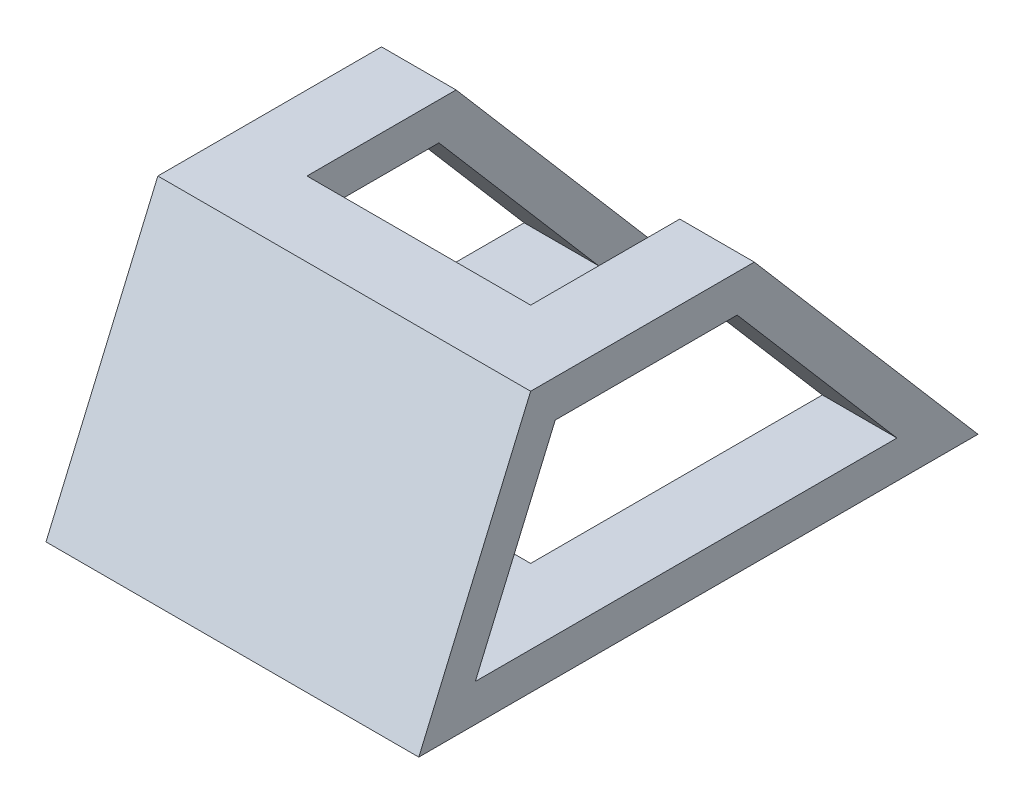
ISO-10303-21;
HEADER;
FILE_DESCRIPTION(('STEP AP214'),'2;1');
FILE_NAME('part.step','',(''),(''),'','','');
FILE_SCHEMA(('AUTOMOTIVE_DESIGN { 1 0 10303 214 1 1 1 1 }'));
ENDSEC;
DATA;
#1=APPLICATION_CONTEXT('core data for automotive mechanical design processes');
#2=APPLICATION_PROTOCOL_DEFINITION('international standard','automotive_design',2000,#1);
#3=PRODUCT_CONTEXT('',#1,'mechanical');
#4=PRODUCT('Part','Part','',(#3));
#5=PRODUCT_RELATED_PRODUCT_CATEGORY('part','',(#4));
#6=PRODUCT_DEFINITION_FORMATION('','',#4);
#7=PRODUCT_DEFINITION_CONTEXT('part definition',#1,'design');
#8=PRODUCT_DEFINITION('design','',#6,#7);
#9=PRODUCT_DEFINITION_SHAPE('','',#8);
#10=(LENGTH_UNIT() NAMED_UNIT(*) SI_UNIT(.MILLI.,.METRE.));
#11=(NAMED_UNIT(*) PLANE_ANGLE_UNIT() SI_UNIT($,.RADIAN.));
#12=(NAMED_UNIT(*) SI_UNIT($,.STERADIAN.) SOLID_ANGLE_UNIT());
#13=UNCERTAINTY_MEASURE_WITH_UNIT(LENGTH_MEASURE(1.E-05),#10,'distance_accuracy_value','');
#14=(GEOMETRIC_REPRESENTATION_CONTEXT(3) GLOBAL_UNCERTAINTY_ASSIGNED_CONTEXT((#13)) GLOBAL_UNIT_ASSIGNED_CONTEXT((#10,
#11,#12)) REPRESENTATION_CONTEXT('',''));
#15=CARTESIAN_POINT('',(0.,0.,0.));
#16=DIRECTION('',(0.,0.,1.));
#17=DIRECTION('',(1.,0.,0.));
#18=AXIS2_PLACEMENT_3D('',#15,#16,#17);
#19=CARTESIAN_POINT('',(-100.,-27.6040869565217,-96.6893641970609));
#20=DIRECTION('',(0.,0.650791373455968,-0.759256602365297));
#21=DIRECTION('',(0.,0.759256602365297,0.650791373455968));
#22=AXIS2_PLACEMENT_3D('',#19,#20,#21);
#23=PLANE('',#22);
#24=DIRECTION('',(0.,0.759256602365297,0.650791373455968));
#25=VECTOR('',#24,1.);
#26=CARTESIAN_POINT('',(-80.,-27.6040869565217,-96.6893641970609));
#27=LINE('',#26,#25);
#28=CARTESIAN_POINT('',(-80.,-27.6040869565218,-96.6893641970609));
#29=VERTEX_POINT('',#28);
#30=CARTESIAN_POINT('',(-80.,42.3959130434783,-36.6893641970609));
#31=VERTEX_POINT('',#30);
#32=EDGE_CURVE('E156',#29,#31,#27,.T.);
#33=ORIENTED_EDGE('',*,*,#32,.F.);
#34=DIRECTION('',(1.,0.,0.));
#35=VECTOR('',#34,1.);
#36=CARTESIAN_POINT('',(-100.,-27.6040869565217,-96.6893641970609));
#37=LINE('',#36,#35);
#38=CARTESIAN_POINT('',(-100.,-27.6040869565217,-96.6893641970609));
#39=VERTEX_POINT('',#38);
#40=EDGE_CURVE('E169',#39,#29,#37,.T.);
#41=ORIENTED_EDGE('',*,*,#40,.F.);
#42=DIRECTION('',(0.,0.759256602365297,0.650791373455968));
#43=VECTOR('',#42,1.);
#44=CARTESIAN_POINT('',(-100.,-27.6040869565217,-96.6893641970609));
#45=LINE('',#44,#43);
#46=CARTESIAN_POINT('',(-100.,42.3959130434783,-36.6893641970609));
#47=VERTEX_POINT('',#46);
#48=EDGE_CURVE('E263',#39,#47,#45,.T.);
#49=ORIENTED_EDGE('',*,*,#48,.T.);
#50=DIRECTION('',(1.,0.,0.));
#51=VECTOR('',#50,1.);
#52=CARTESIAN_POINT('',(-100.,42.3959130434783,-36.6893641970609));
#53=LINE('',#52,#51);
#54=EDGE_CURVE('E171',#47,#31,#53,.T.);
#55=ORIENTED_EDGE('',*,*,#54,.T.);
#56=EDGE_LOOP('',(#33,#41,#49,#55));
#57=FACE_BOUND('',#56,.T.);
#58=ADVANCED_FACE('F41',(#57),#23,.T.);
#59=CARTESIAN_POINT('',(-100.,-17.6040869565217,-74.9471578294996));
#60=DIRECTION('',(0.,0.650791373455968,-0.759256602365297));
#61=DIRECTION('',(0.,0.759256602365297,0.650791373455968));
#62=AXIS2_PLACEMENT_3D('',#59,#60,#61);
#63=PLANE('',#62);
#64=DIRECTION('',(1.,0.,0.));
#65=VECTOR('',#64,1.);
#66=CARTESIAN_POINT('',(-100.,-17.6040869565217,-74.9471578294996));
#67=LINE('',#66,#65);
#68=CARTESIAN_POINT('',(-100.,-17.6040869565217,-74.9471578294996));
#69=VERTEX_POINT('',#68);
#70=CARTESIAN_POINT('',(-80.,-17.6040869565217,-74.9471578294996));
#71=VERTEX_POINT('',#70);
#72=EDGE_CURVE('E247',#69,#71,#67,.T.);
#73=ORIENTED_EDGE('',*,*,#72,.T.);
#74=DIRECTION('',(0.,0.759256602365297,0.650791373455968));
#75=VECTOR('',#74,1.);
#76=CARTESIAN_POINT('',(-80.,-17.6040869565217,-74.9471578294996));
#77=LINE('',#76,#75);
#78=CARTESIAN_POINT('',(-80.,32.3959130434783,-32.0900149723567));
#79=VERTEX_POINT('',#78);
#80=EDGE_CURVE('E219',#71,#79,#77,.T.);
#81=ORIENTED_EDGE('',*,*,#80,.T.);
#82=DIRECTION('',(1.,0.,0.));
#83=VECTOR('',#82,1.);
#84=CARTESIAN_POINT('',(-100.,32.3959130434783,-32.0900149723567));
#85=LINE('',#84,#83);
#86=CARTESIAN_POINT('',(-100.,32.3959130434783,-32.0900149723567));
#87=VERTEX_POINT('',#86);
#88=EDGE_CURVE('E256',#87,#79,#85,.T.);
#89=ORIENTED_EDGE('',*,*,#88,.F.);
#90=DIRECTION('',(0.,0.759256602365297,0.650791373455968));
#91=VECTOR('',#90,1.);
#92=CARTESIAN_POINT('',(-100.,-17.6040869565217,-74.9471578294996));
#93=LINE('',#92,#91);
#94=EDGE_CURVE('E223',#69,#87,#93,.T.);
#95=ORIENTED_EDGE('',*,*,#94,.F.);
#96=EDGE_LOOP('',(#73,#81,#89,#95));
#97=FACE_BOUND('',#96,.T.);
#98=ADVANCED_FACE('F322',(#97),#63,.F.);
#99=CARTESIAN_POINT('',(-100.,42.3959130434783,23.3106358029391));
#100=DIRECTION('',(0.,0.393919298579168,0.919145030018058));
#101=DIRECTION('',(0.,-0.919145030018058,0.393919298579168));
#102=AXIS2_PLACEMENT_3D('',#99,#100,#101);
#103=PLANE('',#102);
#104=DIRECTION('',(0.,-0.919145030018058,0.393919298579168));
#105=VECTOR('',#104,1.);
#106=CARTESIAN_POINT('',(0.,42.3959130434783,23.3106358029391));
#107=LINE('',#106,#105);
#108=CARTESIAN_POINT('',(0.,42.3959130434783,23.3106358029391));
#109=VERTEX_POINT('',#108);
#110=CARTESIAN_POINT('',(0.,-27.6040869565217,53.3106358029391));
#111=VERTEX_POINT('',#110);
#112=EDGE_CURVE('E250',#109,#111,#107,.T.);
#113=ORIENTED_EDGE('',*,*,#112,.F.);
#114=DIRECTION('',(1.,0.,0.));
#115=VECTOR('',#114,1.);
#116=CARTESIAN_POINT('',(-100.,42.3959130434783,23.3106358029391));
#117=LINE('',#116,#115);
#118=CARTESIAN_POINT('',(-100.,42.3959130434783,23.3106358029391));
#119=VERTEX_POINT('',#118);
#120=EDGE_CURVE('E189',#119,#109,#117,.T.);
#121=ORIENTED_EDGE('',*,*,#120,.F.);
#122=DIRECTION('',(0.,-0.919145030018058,0.393919298579168));
#123=VECTOR('',#122,1.);
#124=CARTESIAN_POINT('',(-100.,42.3959130434783,23.3106358029391));
#125=LINE('',#124,#123);
#126=CARTESIAN_POINT('',(-100.,-27.6040869565217,53.3106358029391));
#127=VERTEX_POINT('',#126);
#128=EDGE_CURVE('E258',#119,#127,#125,.T.);
#129=ORIENTED_EDGE('',*,*,#128,.T.);
#130=DIRECTION('',(1.,0.,0.));
#131=VECTOR('',#130,1.);
#132=CARTESIAN_POINT('',(-100.,-27.6040869565217,53.3106358029391));
#133=LINE('',#132,#131);
#134=EDGE_CURVE('E183',#127,#111,#133,.T.);
#135=ORIENTED_EDGE('',*,*,#134,.T.);
#136=EDGE_LOOP('',(#113,#121,#129,#135));
#137=FACE_BOUND('',#136,.T.);
#138=ADVANCED_FACE('F43',(#137),#103,.T.);
#139=CARTESIAN_POINT('',(-100.,42.3959130434783,-36.6893641970609));
#140=DIRECTION('',(0.,1.,0.));
#141=DIRECTION('',(0.,0.,1.));
#142=AXIS2_PLACEMENT_3D('',#139,#140,#141);
#143=PLANE('',#142);
#144=DIRECTION('',(0.,0.,1.));
#145=VECTOR('',#144,1.);
#146=CARTESIAN_POINT('',(-80.,42.3959130434783,-96.6893641970609));
#147=LINE('',#146,#145);
#148=CARTESIAN_POINT('',(-80.,42.3959130434783,3.31063580293914));
#149=VERTEX_POINT('',#148);
#150=EDGE_CURVE('E204',#31,#149,#147,.T.);
#151=ORIENTED_EDGE('',*,*,#150,.F.);
#152=ORIENTED_EDGE('',*,*,#54,.F.);
#153=DIRECTION('',(0.,0.,1.));
#154=VECTOR('',#153,1.);
#155=CARTESIAN_POINT('',(-100.,42.3959130434783,-36.6893641970609));
#156=LINE('',#155,#154);
#157=EDGE_CURVE('E187',#47,#119,#156,.T.);
#158=ORIENTED_EDGE('',*,*,#157,.T.);
#159=ORIENTED_EDGE('',*,*,#120,.T.);
#160=DIRECTION('',(0.,0.,1.));
#161=VECTOR('',#160,1.);
#162=CARTESIAN_POINT('',(0.,42.3959130434783,-36.6893641970609));
#163=LINE('',#162,#161);
#164=CARTESIAN_POINT('',(0.,42.3959130434783,-36.6893641970609));
#165=VERTEX_POINT('',#164);
#166=EDGE_CURVE('E261',#165,#109,#163,.T.);
#167=ORIENTED_EDGE('',*,*,#166,.F.);
#168=CARTESIAN_POINT('',(-20.,42.3959130434783,-36.6893641970609));
#169=VERTEX_POINT('',#168);
#170=EDGE_CURVE('E179',#169,#165,#53,.T.);
#171=ORIENTED_EDGE('',*,*,#170,.F.);
#172=DIRECTION('',(0.,0.,-1.));
#173=VECTOR('',#172,1.);
#174=CARTESIAN_POINT('',(-20.,42.3959130434783,-96.6893641970609));
#175=LINE('',#174,#173);
#176=CARTESIAN_POINT('',(-20.,42.3959130434783,3.31063580293914));
#177=VERTEX_POINT('',#176);
#178=EDGE_CURVE('E292',#177,#169,#175,.T.);
#179=ORIENTED_EDGE('',*,*,#178,.F.);
#180=DIRECTION('',(1.,0.,0.));
#181=VECTOR('',#180,1.);
#182=CARTESIAN_POINT('',(-80.,42.3959130434783,3.31063580293914));
#183=LINE('',#182,#181);
#184=EDGE_CURVE('E164',#149,#177,#183,.T.);
#185=ORIENTED_EDGE('',*,*,#184,.F.);
#186=EDGE_LOOP('',(#151,#152,#158,#159,#167,#171,#179,#185));
#187=FACE_BOUND('',#186,.T.);
#188=ADVANCED_FACE('F279',(#187),#143,.T.);
#189=DIRECTION('',(0.,-0.759256602365297,-0.650791373455968));
#190=VECTOR('',#189,1.);
#191=CARTESIAN_POINT('',(-20.,-27.6040869565217,-96.6893641970609));
#192=LINE('',#191,#190);
#193=CARTESIAN_POINT('',(-20.,-27.6040869565217,-96.6893641970609));
#194=VERTEX_POINT('',#193);
#195=EDGE_CURVE('E56',#169,#194,#192,.T.);
#196=ORIENTED_EDGE('',*,*,#195,.F.);
#197=ORIENTED_EDGE('',*,*,#170,.T.);
#198=DIRECTION('',(0.,0.759256602365297,0.650791373455968));
#199=VECTOR('',#198,1.);
#200=CARTESIAN_POINT('',(0.,-27.6040869565217,-96.6893641970609));
#201=LINE('',#200,#199);
#202=CARTESIAN_POINT('',(0.,-27.6040869565217,-96.6893641970609));
#203=VERTEX_POINT('',#202);
#204=EDGE_CURVE('E272',#203,#165,#201,.T.);
#205=ORIENTED_EDGE('',*,*,#204,.F.);
#206=EDGE_CURVE('E180',#194,#203,#37,.T.);
#207=ORIENTED_EDGE('',*,*,#206,.F.);
#208=EDGE_LOOP('',(#196,#197,#205,#207));
#209=FACE_BOUND('',#208,.T.);
#210=ADVANCED_FACE('F290',(#209),#23,.T.);
#211=CARTESIAN_POINT('',(-100.,-27.6040869565217,53.3106358029391));
#212=DIRECTION('',(0.,-1.,0.));
#213=DIRECTION('',(0.,0.,-1.));
#214=AXIS2_PLACEMENT_3D('',#211,#212,#213);
#215=PLANE('',#214);
#216=DIRECTION('',(0.,0.,1.));
#217=VECTOR('',#216,1.);
#218=CARTESIAN_POINT('',(-80.,-27.6040869565217,-96.6893641970609));
#219=LINE('',#218,#217);
#220=CARTESIAN_POINT('',(-80.,-27.6040869565217,3.31063580293914));
#221=VERTEX_POINT('',#220);
#222=EDGE_CURVE('E153',#29,#221,#219,.T.);
#223=ORIENTED_EDGE('',*,*,#222,.T.);
#224=DIRECTION('',(1.,0.,0.));
#225=VECTOR('',#224,1.);
#226=CARTESIAN_POINT('',(-80.,-27.6040869565217,3.31063580293914));
#227=LINE('',#226,#225);
#228=CARTESIAN_POINT('',(-20.,-27.6040869565217,3.31063580293914));
#229=VERTEX_POINT('',#228);
#230=EDGE_CURVE('E206',#221,#229,#227,.T.);
#231=ORIENTED_EDGE('',*,*,#230,.T.);
#232=DIRECTION('',(0.,0.,-1.));
#233=VECTOR('',#232,1.);
#234=CARTESIAN_POINT('',(-20.,-27.6040869565217,-96.6893641970609));
#235=LINE('',#234,#233);
#236=EDGE_CURVE('E212',#229,#194,#235,.T.);
#237=ORIENTED_EDGE('',*,*,#236,.T.);
#238=ORIENTED_EDGE('',*,*,#206,.T.);
#239=DIRECTION('',(0.,0.,-1.));
#240=VECTOR('',#239,1.);
#241=CARTESIAN_POINT('',(0.,-27.6040869565217,53.3106358029391));
#242=LINE('',#241,#240);
#243=EDGE_CURVE('E269',#111,#203,#242,.T.);
#244=ORIENTED_EDGE('',*,*,#243,.F.);
#245=ORIENTED_EDGE('',*,*,#134,.F.);
#246=DIRECTION('',(0.,0.,-1.));
#247=VECTOR('',#246,1.);
#248=CARTESIAN_POINT('',(-100.,-27.6040869565217,53.3106358029391));
#249=LINE('',#248,#247);
#250=EDGE_CURVE('E178',#127,#39,#249,.T.);
#251=ORIENTED_EDGE('',*,*,#250,.T.);
#252=ORIENTED_EDGE('',*,*,#40,.T.);
#253=EDGE_LOOP('',(#223,#231,#237,#238,#244,#245,#251,#252));
#254=FACE_BOUND('',#253,.T.);
#255=ADVANCED_FACE('F176',(#254),#215,.T.);
#256=CARTESIAN_POINT('',(-100.,0.,0.));
#257=DIRECTION('',(1.,0.,0.));
#258=DIRECTION('',(0.,0.,-1.));
#259=AXIS2_PLACEMENT_3D('',#256,#257,#258);
#260=PLANE('',#259);
#261=DIRECTION('',(0.,0.,-1.));
#262=VECTOR('',#261,1.);
#263=CARTESIAN_POINT('',(-100.,-17.6040869565217,38.145245651705));
#264=LINE('',#263,#262);
#265=CARTESIAN_POINT('',(-100.,-17.6040869565217,38.145245651705));
#266=VERTEX_POINT('',#265);
#267=EDGE_CURVE('E233',#266,#69,#264,.T.);
#268=ORIENTED_EDGE('',*,*,#267,.T.);
#269=ORIENTED_EDGE('',*,*,#94,.T.);
#270=DIRECTION('',(0.,0.,1.));
#271=VECTOR('',#270,1.);
#272=CARTESIAN_POINT('',(-100.,32.3959130434783,-32.0900149723567));
#273=LINE('',#272,#271);
#274=CARTESIAN_POINT('',(-100.,32.3959130434783,16.7166742231335));
#275=VERTEX_POINT('',#274);
#276=EDGE_CURVE('E226',#87,#275,#273,.T.);
#277=ORIENTED_EDGE('',*,*,#276,.T.);
#278=DIRECTION('',(0.,-0.919145030018058,0.393919298579168));
#279=VECTOR('',#278,1.);
#280=CARTESIAN_POINT('',(-100.,32.3959130434783,16.7166742231335));
#281=LINE('',#280,#279);
#282=EDGE_CURVE('E230',#275,#266,#281,.T.);
#283=ORIENTED_EDGE('',*,*,#282,.T.);
#284=EDGE_LOOP('',(#268,#269,#277,#283));
#285=FACE_BOUND('',#284,.T.);
#286=ORIENTED_EDGE('',*,*,#128,.F.);
#287=ORIENTED_EDGE('',*,*,#157,.F.);
#288=ORIENTED_EDGE('',*,*,#48,.F.);
#289=ORIENTED_EDGE('',*,*,#250,.F.);
#290=EDGE_LOOP('',(#286,#287,#288,#289));
#291=FACE_BOUND('',#290,.T.);
#292=ADVANCED_FACE('F318',(#285,#291),#260,.F.);
#293=CARTESIAN_POINT('',(0.,0.,0.));
#294=DIRECTION('',(1.,0.,0.));
#295=DIRECTION('',(0.,0.,-1.));
#296=AXIS2_PLACEMENT_3D('',#293,#294,#295);
#297=PLANE('',#296);
#298=DIRECTION('',(0.,0.759256602365297,0.650791373455968));
#299=VECTOR('',#298,1.);
#300=CARTESIAN_POINT('',(0.,-17.6040869565217,-74.9471578294996));
#301=LINE('',#300,#299);
#302=CARTESIAN_POINT('',(0.,-17.6040869565217,-74.9471578294996));
#303=VERTEX_POINT('',#302);
#304=CARTESIAN_POINT('',(0.,32.3959130434783,-32.0900149723567));
#305=VERTEX_POINT('',#304);
#306=EDGE_CURVE('E172',#303,#305,#301,.T.);
#307=ORIENTED_EDGE('',*,*,#306,.F.);
#308=DIRECTION('',(0.,0.,-1.));
#309=VECTOR('',#308,1.);
#310=CARTESIAN_POINT('',(0.,-17.6040869565217,38.145245651705));
#311=LINE('',#310,#309);
#312=CARTESIAN_POINT('',(0.,-17.6040869565217,38.145245651705));
#313=VERTEX_POINT('',#312);
#314=EDGE_CURVE('E227',#313,#303,#311,.T.);
#315=ORIENTED_EDGE('',*,*,#314,.F.);
#316=DIRECTION('',(0.,-0.919145030018058,0.393919298579168));
#317=VECTOR('',#316,1.);
#318=CARTESIAN_POINT('',(0.,32.3959130434783,16.7166742231335));
#319=LINE('',#318,#317);
#320=CARTESIAN_POINT('',(0.,32.3959130434783,16.7166742231335));
#321=VERTEX_POINT('',#320);
#322=EDGE_CURVE('E242',#321,#313,#319,.T.);
#323=ORIENTED_EDGE('',*,*,#322,.F.);
#324=DIRECTION('',(0.,0.,1.));
#325=VECTOR('',#324,1.);
#326=CARTESIAN_POINT('',(0.,32.3959130434783,-32.0900149723567));
#327=LINE('',#326,#325);
#328=EDGE_CURVE('E239',#305,#321,#327,.T.);
#329=ORIENTED_EDGE('',*,*,#328,.F.);
#330=EDGE_LOOP('',(#307,#315,#323,#329));
#331=FACE_BOUND('',#330,.T.);
#332=ORIENTED_EDGE('',*,*,#112,.T.);
#333=ORIENTED_EDGE('',*,*,#243,.T.);
#334=ORIENTED_EDGE('',*,*,#204,.T.);
#335=ORIENTED_EDGE('',*,*,#166,.T.);
#336=EDGE_LOOP('',(#332,#333,#334,#335));
#337=FACE_BOUND('',#336,.T.);
#338=ADVANCED_FACE('F286',(#331,#337),#297,.T.);
#339=CARTESIAN_POINT('',(-20.,32.3959130434783,-32.0900149723567));
#340=VERTEX_POINT('',#339);
#341=EDGE_CURVE('E236',#340,#305,#85,.T.);
#342=ORIENTED_EDGE('',*,*,#341,.F.);
#343=DIRECTION('',(0.,-0.759256602365297,-0.650791373455968));
#344=VECTOR('',#343,1.);
#345=CARTESIAN_POINT('',(-20.,-17.6040869565217,-74.9471578294996));
#346=LINE('',#345,#344);
#347=CARTESIAN_POINT('',(-20.,-17.6040869565217,-74.9471578294996));
#348=VERTEX_POINT('',#347);
#349=EDGE_CURVE('E63',#340,#348,#346,.T.);
#350=ORIENTED_EDGE('',*,*,#349,.T.);
#351=EDGE_CURVE('E251',#348,#303,#67,.T.);
#352=ORIENTED_EDGE('',*,*,#351,.T.);
#353=ORIENTED_EDGE('',*,*,#306,.T.);
#354=EDGE_LOOP('',(#342,#350,#352,#353));
#355=FACE_BOUND('',#354,.T.);
#356=ADVANCED_FACE('F308',(#355),#63,.F.);
#357=CARTESIAN_POINT('',(-100.,-17.6040869565217,38.145245651705));
#358=DIRECTION('',(0.,-1.,0.));
#359=DIRECTION('',(0.,0.,-1.));
#360=AXIS2_PLACEMENT_3D('',#357,#358,#359);
#361=PLANE('',#360);
#362=DIRECTION('',(-1.,0.,0.));
#363=VECTOR('',#362,1.);
#364=CARTESIAN_POINT('',(-100.,-17.6040869565217,3.31063580293914));
#365=LINE('',#364,#363);
#366=CARTESIAN_POINT('',(-20.,-17.6040869565218,3.31063580293914));
#367=VERTEX_POINT('',#366);
#368=CARTESIAN_POINT('',(-80.,-17.6040869565218,3.31063580293914));
#369=VERTEX_POINT('',#368);
#370=EDGE_CURVE('E216',#367,#369,#365,.T.);
#371=ORIENTED_EDGE('',*,*,#370,.T.);
#372=DIRECTION('',(0.,0.,-1.));
#373=VECTOR('',#372,1.);
#374=CARTESIAN_POINT('',(-80.,-17.6040869565217,38.145245651705));
#375=LINE('',#374,#373);
#376=EDGE_CURVE('E173',#369,#71,#375,.T.);
#377=ORIENTED_EDGE('',*,*,#376,.T.);
#378=ORIENTED_EDGE('',*,*,#72,.F.);
#379=ORIENTED_EDGE('',*,*,#267,.F.);
#380=DIRECTION('',(1.,0.,0.));
#381=VECTOR('',#380,1.);
#382=CARTESIAN_POINT('',(-100.,-17.6040869565217,38.145245651705));
#383=LINE('',#382,#381);
#384=EDGE_CURVE('E252',#266,#313,#383,.T.);
#385=ORIENTED_EDGE('',*,*,#384,.T.);
#386=ORIENTED_EDGE('',*,*,#314,.T.);
#387=ORIENTED_EDGE('',*,*,#351,.F.);
#388=DIRECTION('',(0.,0.,1.));
#389=VECTOR('',#388,1.);
#390=CARTESIAN_POINT('',(-20.,-17.6040869565217,38.145245651705));
#391=LINE('',#390,#389);
#392=EDGE_CURVE('E211',#348,#367,#391,.T.);
#393=ORIENTED_EDGE('',*,*,#392,.T.);
#394=EDGE_LOOP('',(#371,#377,#378,#379,#385,#386,#387,#393));
#395=FACE_BOUND('',#394,.T.);
#396=ADVANCED_FACE('F304',(#395),#361,.F.);
#397=CARTESIAN_POINT('',(-100.,32.3959130434783,16.7166742231335));
#398=DIRECTION('',(0.,0.393919298579168,0.919145030018058));
#399=DIRECTION('',(0.,-0.919145030018058,0.393919298579168));
#400=AXIS2_PLACEMENT_3D('',#397,#398,#399);
#401=PLANE('',#400);
#402=ORIENTED_EDGE('',*,*,#322,.T.);
#403=ORIENTED_EDGE('',*,*,#384,.F.);
#404=ORIENTED_EDGE('',*,*,#282,.F.);
#405=DIRECTION('',(1.,0.,0.));
#406=VECTOR('',#405,1.);
#407=CARTESIAN_POINT('',(-100.,32.3959130434783,16.7166742231335));
#408=LINE('',#407,#406);
#409=EDGE_CURVE('E254',#275,#321,#408,.T.);
#410=ORIENTED_EDGE('',*,*,#409,.T.);
#411=EDGE_LOOP('',(#402,#403,#404,#410));
#412=FACE_BOUND('',#411,.T.);
#413=ADVANCED_FACE('F315',(#412),#401,.F.);
#414=CARTESIAN_POINT('',(-100.,32.3959130434783,-32.0900149723567));
#415=DIRECTION('',(0.,1.,0.));
#416=DIRECTION('',(0.,0.,1.));
#417=AXIS2_PLACEMENT_3D('',#414,#415,#416);
#418=PLANE('',#417);
#419=ORIENTED_EDGE('',*,*,#88,.T.);
#420=DIRECTION('',(0.,0.,1.));
#421=VECTOR('',#420,1.);
#422=CARTESIAN_POINT('',(-80.,32.3959130434783,-32.0900149723567));
#423=LINE('',#422,#421);
#424=CARTESIAN_POINT('',(-80.,32.3959130434782,3.31063580293914));
#425=VERTEX_POINT('',#424);
#426=EDGE_CURVE('E11',#79,#425,#423,.T.);
#427=ORIENTED_EDGE('',*,*,#426,.T.);
#428=DIRECTION('',(1.,0.,0.));
#429=VECTOR('',#428,1.);
#430=CARTESIAN_POINT('',(-100.,32.3959130434783,3.31063580293913));
#431=LINE('',#430,#429);
#432=CARTESIAN_POINT('',(-20.,32.3959130434782,3.31063580293914));
#433=VERTEX_POINT('',#432);
#434=EDGE_CURVE('E49',#425,#433,#431,.T.);
#435=ORIENTED_EDGE('',*,*,#434,.T.);
#436=DIRECTION('',(0.,0.,-1.));
#437=VECTOR('',#436,1.);
#438=CARTESIAN_POINT('',(-20.,32.3959130434783,-32.0900149723568));
#439=LINE('',#438,#437);
#440=EDGE_CURVE('E188',#433,#340,#439,.T.);
#441=ORIENTED_EDGE('',*,*,#440,.T.);
#442=ORIENTED_EDGE('',*,*,#341,.T.);
#443=ORIENTED_EDGE('',*,*,#328,.T.);
#444=ORIENTED_EDGE('',*,*,#409,.F.);
#445=ORIENTED_EDGE('',*,*,#276,.F.);
#446=EDGE_LOOP('',(#419,#427,#435,#441,#442,#443,#444,#445));
#447=FACE_BOUND('',#446,.T.);
#448=ADVANCED_FACE('F193',(#447),#418,.F.);
#449=CARTESIAN_POINT('',(-80.,-144.223124853428,-96.6893641970609));
#450=DIRECTION('',(-1.,0.,0.));
#451=DIRECTION('',(0.,0.,1.));
#452=AXIS2_PLACEMENT_3D('',#449,#450,#451);
#453=PLANE('',#452);
#454=ORIENTED_EDGE('',*,*,#32,.T.);
#455=ORIENTED_EDGE('',*,*,#150,.T.);
#456=DIRECTION('',(0.,1.,0.));
#457=VECTOR('',#456,1.);
#458=CARTESIAN_POINT('',(-80.,-144.223124853428,3.31063580293914));
#459=LINE('',#458,#457);
#460=EDGE_CURVE('E163',#425,#149,#459,.T.);
#461=ORIENTED_EDGE('',*,*,#460,.F.);
#462=ORIENTED_EDGE('',*,*,#426,.F.);
#463=ORIENTED_EDGE('',*,*,#80,.F.);
#464=ORIENTED_EDGE('',*,*,#376,.F.);
#465=EDGE_CURVE('E159',#221,#369,#459,.T.);
#466=ORIENTED_EDGE('',*,*,#465,.F.);
#467=ORIENTED_EDGE('',*,*,#222,.F.);
#468=EDGE_LOOP('',(#454,#455,#461,#462,#463,#464,#466,#467));
#469=FACE_BOUND('',#468,.T.);
#470=ADVANCED_FACE('F155',(#469),#453,.F.);
#471=CARTESIAN_POINT('',(-80.,-144.223124853428,3.31063580293914));
#472=DIRECTION('',(0.,0.,1.));
#473=DIRECTION('',(1.,0.,0.));
#474=AXIS2_PLACEMENT_3D('',#471,#472,#473);
#475=PLANE('',#474);
#476=DIRECTION('',(0.,1.,0.));
#477=VECTOR('',#476,1.);
#478=CARTESIAN_POINT('',(-20.,-144.223124853428,3.31063580293914));
#479=LINE('',#478,#477);
#480=EDGE_CURVE('E209',#229,#367,#479,.T.);
#481=ORIENTED_EDGE('',*,*,#480,.F.);
#482=ORIENTED_EDGE('',*,*,#230,.F.);
#483=ORIENTED_EDGE('',*,*,#465,.T.);
#484=ORIENTED_EDGE('',*,*,#370,.F.);
#485=EDGE_LOOP('',(#481,#482,#483,#484));
#486=FACE_BOUND('',#485,.T.);
#487=ADVANCED_FACE('F323',(#486),#475,.F.);
#488=ORIENTED_EDGE('',*,*,#460,.T.);
#489=ORIENTED_EDGE('',*,*,#184,.T.);
#490=EDGE_CURVE('E202',#433,#177,#479,.T.);
#491=ORIENTED_EDGE('',*,*,#490,.F.);
#492=ORIENTED_EDGE('',*,*,#434,.F.);
#493=EDGE_LOOP('',(#488,#489,#491,#492));
#494=FACE_BOUND('',#493,.T.);
#495=ADVANCED_FACE('F199',(#494),#475,.F.);
#496=CARTESIAN_POINT('',(-20.,-144.223124853428,-96.6893641970609));
#497=DIRECTION('',(1.,0.,0.));
#498=DIRECTION('',(0.,0.,-1.));
#499=AXIS2_PLACEMENT_3D('',#496,#497,#498);
#500=PLANE('',#499);
#501=ORIENTED_EDGE('',*,*,#195,.T.);
#502=ORIENTED_EDGE('',*,*,#236,.F.);
#503=ORIENTED_EDGE('',*,*,#480,.T.);
#504=ORIENTED_EDGE('',*,*,#392,.F.);
#505=ORIENTED_EDGE('',*,*,#349,.F.);
#506=ORIENTED_EDGE('',*,*,#440,.F.);
#507=ORIENTED_EDGE('',*,*,#490,.T.);
#508=ORIENTED_EDGE('',*,*,#178,.T.);
#509=EDGE_LOOP('',(#501,#502,#503,#504,#505,#506,#507,#508));
#510=FACE_BOUND('',#509,.T.);
#511=ADVANCED_FACE('F300',(#510),#500,.F.);
#512=CLOSED_SHELL('',(#58,#98,#138,#188,#210,#255,#292,#338,#356,#396,#413,#448,#470,#487,#495,#511));
#513=MANIFOLD_SOLID_BREP('B2',#512);
#514=ADVANCED_BREP_SHAPE_REPRESENTATION('',(#18,#513),#14);
#515=SHAPE_DEFINITION_REPRESENTATION(#9,#514);
ENDSEC;
END-ISO-10303-21;
